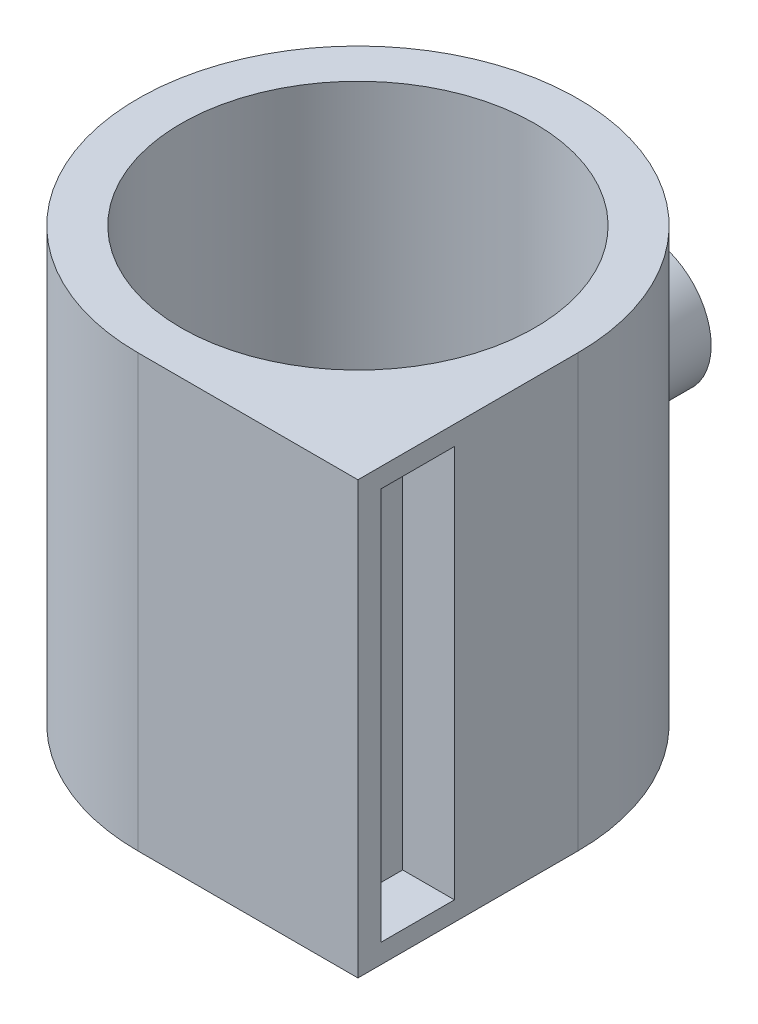
ISO-10303-21;
HEADER;
FILE_DESCRIPTION(('STEP AP214'),'2;1');
FILE_NAME('part.step','',(''),(''),'','','');
FILE_SCHEMA(('AUTOMOTIVE_DESIGN { 1 0 10303 214 1 1 1 1 }'));
ENDSEC;
DATA;
#1=APPLICATION_CONTEXT('core data for automotive mechanical design processes');
#2=APPLICATION_PROTOCOL_DEFINITION('international standard','automotive_design',2000,#1);
#3=PRODUCT_CONTEXT('',#1,'mechanical');
#4=PRODUCT('Part','Part','',(#3));
#5=PRODUCT_RELATED_PRODUCT_CATEGORY('part','',(#4));
#6=PRODUCT_DEFINITION_FORMATION('','',#4);
#7=PRODUCT_DEFINITION_CONTEXT('part definition',#1,'design');
#8=PRODUCT_DEFINITION('design','',#6,#7);
#9=PRODUCT_DEFINITION_SHAPE('','',#8);
#10=(LENGTH_UNIT() NAMED_UNIT(*) SI_UNIT(.MILLI.,.METRE.));
#11=(NAMED_UNIT(*) PLANE_ANGLE_UNIT() SI_UNIT($,.RADIAN.));
#12=(NAMED_UNIT(*) SI_UNIT($,.STERADIAN.) SOLID_ANGLE_UNIT());
#13=UNCERTAINTY_MEASURE_WITH_UNIT(LENGTH_MEASURE(1.E-05),#10,'distance_accuracy_value','');
#14=(GEOMETRIC_REPRESENTATION_CONTEXT(3) GLOBAL_UNCERTAINTY_ASSIGNED_CONTEXT((#13)) GLOBAL_UNIT_ASSIGNED_CONTEXT((#10,
#11,#12)) REPRESENTATION_CONTEXT('',''));
#15=CARTESIAN_POINT('',(0.,0.,0.));
#16=DIRECTION('',(0.,0.,1.));
#17=DIRECTION('',(1.,0.,0.));
#18=AXIS2_PLACEMENT_3D('',#15,#16,#17);
#19=CARTESIAN_POINT('',(-77.5,0.,0.));
#20=DIRECTION('',(1.,0.,0.));
#21=DIRECTION('',(0.,0.,-1.));
#22=AXIS2_PLACEMENT_3D('',#19,#20,#21);
#23=PLANE('',#22);
#24=DIRECTION('',(0.,1.,0.));
#25=VECTOR('',#24,1.);
#26=CARTESIAN_POINT('',(-77.5,47.75,-4.25248903601283));
#27=LINE('',#26,#25);
#28=CARTESIAN_POINT('',(-77.5,2.24999999999999,-4.25248903601283));
#29=VERTEX_POINT('',#28);
#30=CARTESIAN_POINT('',(-77.5,47.75,-4.25248903601283));
#31=VERTEX_POINT('',#30);
#32=EDGE_CURVE('E60',#29,#31,#27,.T.);
#33=ORIENTED_EDGE('',*,*,#32,.F.);
#34=DIRECTION('',(0.,0.,-1.));
#35=VECTOR('',#34,1.);
#36=CARTESIAN_POINT('',(-77.5,2.24999999999999,4.24751096398717));
#37=LINE('',#36,#35);
#38=CARTESIAN_POINT('',(-77.5,2.24999999999999,4.24751096398717));
#39=VERTEX_POINT('',#38);
#40=EDGE_CURVE('E213',#39,#29,#37,.T.);
#41=ORIENTED_EDGE('',*,*,#40,.F.);
#42=DIRECTION('',(0.,-1.,0.));
#43=VECTOR('',#42,1.);
#44=CARTESIAN_POINT('',(-77.5,47.75,4.24751096398718));
#45=LINE('',#44,#43);
#46=CARTESIAN_POINT('',(-77.5,47.75,4.24751096398718));
#47=VERTEX_POINT('',#46);
#48=EDGE_CURVE('E243',#47,#39,#45,.T.);
#49=ORIENTED_EDGE('',*,*,#48,.F.);
#50=DIRECTION('',(0.,0.,1.));
#51=VECTOR('',#50,1.);
#52=CARTESIAN_POINT('',(-77.5,47.75,4.24751096398718));
#53=LINE('',#52,#51);
#54=EDGE_CURVE('E241',#31,#47,#53,.T.);
#55=ORIENTED_EDGE('',*,*,#54,.F.);
#56=EDGE_LOOP('',(#33,#41,#49,#55));
#57=FACE_BOUND('',#56,.T.);
#58=DIRECTION('',(0.,-1.,0.));
#59=VECTOR('',#58,1.);
#60=CARTESIAN_POINT('',(-77.5,50.,6.93251096398718));
#61=LINE('',#60,#59);
#62=CARTESIAN_POINT('',(-77.5,50.,6.93251096398718));
#63=VERTEX_POINT('',#62);
#64=CARTESIAN_POINT('',(-77.5,0.,6.93251096398718));
#65=VERTEX_POINT('',#64);
#66=EDGE_CURVE('E46',#63,#65,#61,.T.);
#67=ORIENTED_EDGE('',*,*,#66,.T.);
#68=DIRECTION('',(0.,0.,1.));
#69=VECTOR('',#68,1.);
#70=CARTESIAN_POINT('',(-77.5,0.,0.));
#71=LINE('',#70,#69);
#72=CARTESIAN_POINT('',(-77.5,0.,-18.5674890360128));
#73=VERTEX_POINT('',#72);
#74=EDGE_CURVE('E87',#73,#65,#71,.T.);
#75=ORIENTED_EDGE('',*,*,#74,.F.);
#76=DIRECTION('',(0.,-1.,0.));
#77=VECTOR('',#76,1.);
#78=CARTESIAN_POINT('',(-77.5,50.,-18.5674890360128));
#79=LINE('',#78,#77);
#80=CARTESIAN_POINT('',(-77.5,50.,-18.5674890360128));
#81=VERTEX_POINT('',#80);
#82=EDGE_CURVE('E69',#81,#73,#79,.T.);
#83=ORIENTED_EDGE('',*,*,#82,.F.);
#84=DIRECTION('',(0.,0.,1.));
#85=VECTOR('',#84,1.);
#86=CARTESIAN_POINT('',(-77.5,50.,0.));
#87=LINE('',#86,#85);
#88=EDGE_CURVE('E84',#81,#63,#87,.T.);
#89=ORIENTED_EDGE('',*,*,#88,.T.);
#90=EDGE_LOOP('',(#67,#75,#83,#89));
#91=FACE_BOUND('',#90,.T.);
#92=ADVANCED_FACE('F42',(#57,#91),#23,.T.);
#93=CARTESIAN_POINT('',(-103.,25.,-48.));
#94=DIRECTION('',(0.,0.,-1.));
#95=DIRECTION('',(-1.,0.,0.));
#96=AXIS2_PLACEMENT_3D('',#93,#94,#95);
#97=CONICAL_SURFACE('',#96,2.,0.785398163397451);
#98=CARTESIAN_POINT('',(-103.,25.,-52.));
#99=DIRECTION('',(0.,0.,1.));
#100=DIRECTION('',(1.,0.,0.));
#101=AXIS2_PLACEMENT_3D('',#98,#99,#100);
#102=CIRCLE('',#101,6.00000000000006);
#103=CARTESIAN_POINT('',(-109.,25.,-52.));
#104=VERTEX_POINT('',#103);
#105=EDGE_CURVE('E197',#104,#104,#102,.T.);
#106=CARTESIAN_POINT('',(-103.,25.,-48.));
#107=DIRECTION('',(0.,0.,1.));
#108=DIRECTION('',(1.,0.,0.));
#109=AXIS2_PLACEMENT_3D('',#106,#107,#108);
#110=CIRCLE('',#109,2.);
#111=CARTESIAN_POINT('',(-105.,25.,-48.));
#112=VERTEX_POINT('',#111);
#113=EDGE_CURVE('E90',#112,#112,#110,.F.);
#114=CARTESIAN_POINT('',(-109.,25.,-52.));
#115=CARTESIAN_POINT('',(-108.958333333333,25.,-51.9583333333333));
#116=CARTESIAN_POINT('',(-108.916666666667,25.,-51.9166666666667));
#117=CARTESIAN_POINT('',(-108.833333333333,25.,-51.8333333333333));
#118=CARTESIAN_POINT('',(-108.791666666667,25.,-51.7916666666667));
#119=CARTESIAN_POINT('',(-108.708333333333,25.,-51.7083333333333));
#120=CARTESIAN_POINT('',(-108.666666666667,25.,-51.6666666666667));
#121=CARTESIAN_POINT('',(-108.583333333333,25.,-51.5833333333333));
#122=CARTESIAN_POINT('',(-108.541666666667,25.,-51.5416666666667));
#123=CARTESIAN_POINT('',(-108.458333333333,25.,-51.4583333333333));
#124=CARTESIAN_POINT('',(-108.416666666667,25.,-51.4166666666667));
#125=CARTESIAN_POINT('',(-108.333333333333,25.,-51.3333333333333));
#126=CARTESIAN_POINT('',(-108.291666666667,25.,-51.2916666666667));
#127=CARTESIAN_POINT('',(-108.208333333333,25.,-51.2083333333333));
#128=CARTESIAN_POINT('',(-108.166666666667,25.,-51.1666666666667));
#129=CARTESIAN_POINT('',(-108.083333333333,25.,-51.0833333333333));
#130=CARTESIAN_POINT('',(-108.041666666667,25.,-51.0416666666667));
#131=CARTESIAN_POINT('',(-107.958333333333,25.,-50.9583333333333));
#132=CARTESIAN_POINT('',(-107.916666666667,25.,-50.9166666666667));
#133=CARTESIAN_POINT('',(-107.833333333333,25.,-50.8333333333333));
#134=CARTESIAN_POINT('',(-107.791666666667,25.,-50.7916666666667));
#135=CARTESIAN_POINT('',(-107.708333333333,25.,-50.7083333333333));
#136=CARTESIAN_POINT('',(-107.666666666667,25.,-50.6666666666667));
#137=CARTESIAN_POINT('',(-107.583333333333,25.,-50.5833333333333));
#138=CARTESIAN_POINT('',(-107.541666666667,25.,-50.5416666666667));
#139=CARTESIAN_POINT('',(-107.458333333333,25.,-50.4583333333333));
#140=CARTESIAN_POINT('',(-107.416666666667,25.,-50.4166666666667));
#141=CARTESIAN_POINT('',(-107.333333333333,25.,-50.3333333333333));
#142=CARTESIAN_POINT('',(-107.291666666667,25.,-50.2916666666667));
#143=CARTESIAN_POINT('',(-107.208333333333,25.,-50.2083333333333));
#144=CARTESIAN_POINT('',(-107.166666666667,25.,-50.1666666666667));
#145=CARTESIAN_POINT('',(-107.083333333333,25.,-50.0833333333333));
#146=CARTESIAN_POINT('',(-107.041666666667,25.,-50.0416666666667));
#147=CARTESIAN_POINT('',(-106.958333333333,25.,-49.9583333333333));
#148=CARTESIAN_POINT('',(-106.916666666667,25.,-49.9166666666667));
#149=CARTESIAN_POINT('',(-106.833333333333,25.,-49.8333333333333));
#150=CARTESIAN_POINT('',(-106.791666666667,25.,-49.7916666666667));
#151=CARTESIAN_POINT('',(-106.708333333333,25.,-49.7083333333333));
#152=CARTESIAN_POINT('',(-106.666666666667,25.,-49.6666666666667));
#153=CARTESIAN_POINT('',(-106.583333333333,25.,-49.5833333333333));
#154=CARTESIAN_POINT('',(-106.541666666667,25.,-49.5416666666666));
#155=CARTESIAN_POINT('',(-106.458333333333,25.,-49.4583333333333));
#156=CARTESIAN_POINT('',(-106.416666666667,25.,-49.4166666666667));
#157=CARTESIAN_POINT('',(-106.333333333333,25.,-49.3333333333333));
#158=CARTESIAN_POINT('',(-106.291666666667,25.,-49.2916666666666));
#159=CARTESIAN_POINT('',(-106.208333333333,25.,-49.2083333333333));
#160=CARTESIAN_POINT('',(-106.166666666667,25.,-49.1666666666666));
#161=CARTESIAN_POINT('',(-106.083333333333,25.,-49.0833333333333));
#162=CARTESIAN_POINT('',(-106.041666666667,25.,-49.0416666666666));
#163=CARTESIAN_POINT('',(-105.958333333333,25.,-48.9583333333333));
#164=CARTESIAN_POINT('',(-105.916666666667,25.,-48.9166666666666));
#165=CARTESIAN_POINT('',(-105.833333333333,25.,-48.8333333333333));
#166=CARTESIAN_POINT('',(-105.791666666667,25.,-48.7916666666666));
#167=CARTESIAN_POINT('',(-105.708333333333,25.,-48.7083333333333));
#168=CARTESIAN_POINT('',(-105.666666666667,25.,-48.6666666666666));
#169=CARTESIAN_POINT('',(-105.583333333333,25.,-48.5833333333333));
#170=CARTESIAN_POINT('',(-105.541666666667,25.,-48.5416666666666));
#171=CARTESIAN_POINT('',(-105.458333333333,25.,-48.4583333333333));
#172=CARTESIAN_POINT('',(-105.416666666667,25.,-48.4166666666666));
#173=CARTESIAN_POINT('',(-105.333333333333,25.,-48.3333333333333));
#174=CARTESIAN_POINT('',(-105.291666666667,25.,-48.2916666666666));
#175=CARTESIAN_POINT('',(-105.208333333333,25.,-48.2083333333333));
#176=CARTESIAN_POINT('',(-105.166666666667,25.,-48.1666666666666));
#177=CARTESIAN_POINT('',(-105.083333333333,25.,-48.0833333333333));
#178=CARTESIAN_POINT('',(-105.041666666667,25.,-48.0416666666666));
#179=CARTESIAN_POINT('',(-105.,25.,-48.));
#180=B_SPLINE_CURVE_WITH_KNOTS('',3,(#114,#115,#116,#117,#118,#119,#120,#121,#122,#123,#124,
#125,#126,#127,#128,#129,#130,#131,#132,#133,#134,#135,#136,#137,#138,#139,#140,#141,#142,#143,
#144,#145,#146,#147,#148,#149,#150,#151,#152,#153,#154,#155,#156,#157,#158,#159,#160,#161,#162,
#163,#164,#165,#166,#167,#168,#169,#170,#171,#172,#173,#174,#175,#176,#177,#178,#179),
.UNSPECIFIED.,.F.,.F.,(4,2,2,2,2,2,2,2,2,2,2,2,2,2,2,2,2,2,2,2,2,2,2,2,2,2,2,2,2,2,2,2,4),(0.,
0.176776695296637,0.353553390593274,0.530330085889911,0.707106781186548,0.883883476483195,
1.06066017177984,1.23743686707647,1.41421356237311,1.59099025766975,1.76776695296639,
1.94454364826303,2.12132034355966,2.2980970388563,2.47487373415295,2.65165042944959,
2.82842712474622,3.00520382004286,3.1819805153395,3.35875721063614,3.53553390593278,
3.71231060122942,3.88908729652606,4.0658639918227,4.24264068711934,4.41941738241598,
4.59619407771261,4.77297077300926,4.9497474683059,5.12652416360254,5.30330085889918,
5.48007755419581,5.65685424949246),.UNSPECIFIED.);
#181=EDGE_CURVE('BSEAM127',#104,#112,#180,.T.);
#182=ORIENTED_EDGE('',*,*,#105,.F.);
#183=ORIENTED_EDGE('',*,*,#113,.F.);
#184=ORIENTED_EDGE('',*,*,#181,.T.);
#185=ORIENTED_EDGE('',*,*,#181,.F.);
#186=EDGE_LOOP('',(#182,#184,#183,#185));
#187=FACE_BOUND('',#186,.T.);
#188=ADVANCED_FACE('F127',(#187),#97,.F.);
#189=CARTESIAN_POINT('',(-103.,25.,-52.));
#190=DIRECTION('',(0.,0.,1.));
#191=DIRECTION('',(1.,0.,0.));
#192=AXIS2_PLACEMENT_3D('',#189,#190,#191);
#193=PLANE('',#192);
#194=ORIENTED_EDGE('',*,*,#105,.T.);
#195=EDGE_LOOP('',(#194));
#196=FACE_BOUND('',#195,.T.);
#197=CARTESIAN_POINT('',(-103.,25.,-52.));
#198=DIRECTION('',(0.,0.,1.));
#199=DIRECTION('',(1.,0.,0.));
#200=AXIS2_PLACEMENT_3D('',#197,#198,#199);
#201=CIRCLE('',#200,7.50000000000001);
#202=CARTESIAN_POINT('',(-95.5,25.,-52.));
#203=VERTEX_POINT('',#202);
#204=EDGE_CURVE('E52',#203,#203,#201,.T.);
#205=ORIENTED_EDGE('',*,*,#204,.F.);
#206=EDGE_LOOP('',(#205));
#207=FACE_BOUND('',#206,.T.);
#208=ADVANCED_FACE('F149',(#196,#207),#193,.F.);
#209=CARTESIAN_POINT('',(-103.,25.,6.93351096398718));
#210=DIRECTION('',(0.,0.,-1.));
#211=DIRECTION('',(-1.,0.,0.));
#212=AXIS2_PLACEMENT_3D('',#209,#210,#211);
#213=CYLINDRICAL_SURFACE('',#212,2.);
#214=ORIENTED_EDGE('',*,*,#113,.T.);
#215=EDGE_LOOP('',(#214));
#216=FACE_BOUND('',#215,.T.);
#217=CARTESIAN_POINT('',(-105.,25.,-38.969694799116));
#218=CARTESIAN_POINT('',(-104.99999513932,25.1120536873899,-38.9696960830209));
#219=CARTESIAN_POINT('',(-104.990551268163,25.2241818110143,-38.9706278838935));
#220=CARTESIAN_POINT('',(-104.95301990798,25.445330267315,-38.9742539673729));
#221=CARTESIAN_POINT('',(-104.924911781635,25.5543470203842,-38.9769502008886));
#222=CARTESIAN_POINT('',(-104.850877299024,25.7660380858509,-38.9837969003662));
#223=CARTESIAN_POINT('',(-104.80496163447,25.8687161612157,-38.9879464935808));
#224=CARTESIAN_POINT('',(-104.696635754659,26.064885587841,-38.9972312809159));
#225=CARTESIAN_POINT('',(-104.634228854769,26.1583787804375,-39.002366276876));
#226=CARTESIAN_POINT('',(-104.494459327629,26.3338712816188,-39.0130632385346));
#227=CARTESIAN_POINT('',(-104.417051192345,26.4158342719675,-39.0186264715752));
#228=CARTESIAN_POINT('',(-104.249573643612,26.5656271120379,-39.0295415517807));
#229=CARTESIAN_POINT('',(-104.159503655348,26.6334563197759,-39.0348933893348));
#230=CARTESIAN_POINT('',(-103.969037491867,26.7531810437944,-39.0447951171912));
#231=CARTESIAN_POINT('',(-103.868621084027,26.8050445180697,-39.0493433871046));
#232=CARTESIAN_POINT('',(-103.660453106719,26.8911605789493,-39.0571117405789));
#233=CARTESIAN_POINT('',(-103.55270170815,26.9254135757037,-39.0603318550723));
#234=CARTESIAN_POINT('',(-103.333288618737,26.9752301238837,-39.0650721881992));
#235=CARTESIAN_POINT('',(-103.221640561517,26.990853200295,-39.0665978198452));
#236=CARTESIAN_POINT('',(-102.997297329256,27.0031505803758,-39.0677956894787));
#237=CARTESIAN_POINT('',(-102.884602180225,26.9998253534804,-39.067467973382));
#238=CARTESIAN_POINT('',(-102.661767776896,26.9743688951965,-39.0650005083904));
#239=CARTESIAN_POINT('',(-102.55162113255,26.9523016717314,-39.0628669269964));
#240=CARTESIAN_POINT('',(-102.336602413527,26.8900873138496,-39.0570346306012));
#241=CARTESIAN_POINT('',(-102.231730404546,26.8499399543115,-39.053335896112));
#242=CARTESIAN_POINT('',(-102.030035824905,26.7526345966138,-39.0447785722716));
#243=CARTESIAN_POINT('',(-101.933227030357,26.6954482201379,-39.0399180506676));
#244=CARTESIAN_POINT('',(-101.750557253561,26.5657087458206,-39.0295826735495));
#245=CARTESIAN_POINT('',(-101.66469657692,26.4931552191692,-39.0241078008943));
#246=CARTESIAN_POINT('',(-101.505985506016,26.3343808704792,-39.0131313376707));
#247=CARTESIAN_POINT('',(-101.433190794661,26.2481043773937,-39.0076297308037));
#248=CARTESIAN_POINT('',(-101.303108981677,26.0645263432513,-38.9972426506239));
#249=CARTESIAN_POINT('',(-101.245821900805,25.9672247874378,-38.9923571781357));
#250=CARTESIAN_POINT('',(-101.148382079069,25.7643164513261,-38.9837549999125));
#251=CARTESIAN_POINT('',(-101.108232691427,25.6587080504639,-38.9800385229447));
#252=CARTESIAN_POINT('',(-101.046251567772,25.4422046106037,-38.9741998156193));
#253=CARTESIAN_POINT('',(-101.024419301132,25.3313097248476,-38.9720775390797));
#254=CARTESIAN_POINT('',(-100.999763605829,25.1078698005322,-38.9696754412969));
#255=CARTESIAN_POINT('',(-100.996862316182,24.9953334314265,-38.9693880733851));
#256=CARTESIAN_POINT('',(-101.009946534658,24.7713760923895,-38.9706684138276));
#257=CARTESIAN_POINT('',(-101.025931800094,24.6599551081443,-38.9722360983447));
#258=CARTESIAN_POINT('',(-101.076270259815,24.4416177852012,-38.9770430365472));
#259=CARTESIAN_POINT('',(-101.110586713974,24.334692896038,-38.9802789462554));
#260=CARTESIAN_POINT('',(-101.19657594961,24.128117328168,-38.9880550057656));
#261=CARTESIAN_POINT('',(-101.248249110059,24.0284668083502,-38.9925951840453));
#262=CARTESIAN_POINT('',(-101.367680306505,23.8389135776227,-39.0024864883886));
#263=CARTESIAN_POINT('',(-101.435489983319,23.749043540757,-39.0078401976494));
#264=CARTESIAN_POINT('',(-101.585195238741,23.5819335192938,-39.0187468359001));
#265=CARTESIAN_POINT('',(-101.667091149256,23.5046938323837,-39.0242997695817));
#266=CARTESIAN_POINT('',(-101.842981719018,23.364768989681,-39.0350019116049));
#267=CARTESIAN_POINT('',(-101.937016860016,23.3021345947533,-39.040149671886));
#268=CARTESIAN_POINT('',(-102.134316348903,23.1935474389377,-39.0494404043272));
#269=CARTESIAN_POINT('',(-102.237580575624,23.1475944590796,-39.0535833896762));
#270=CARTESIAN_POINT('',(-102.450229011896,23.0737607627662,-39.0603912096784));
#271=CARTESIAN_POINT('',(-102.559602452582,23.0458492723016,-39.0630585602478));
#272=CARTESIAN_POINT('',(-102.781510683826,23.0087904018186,-39.0666248784702));
#273=CARTESIAN_POINT('',(-102.894045390036,22.9996425216417,-39.0675238932595));
#274=CARTESIAN_POINT('',(-103.118582837839,23.0003773856469,-39.0674522365196));
#275=CARTESIAN_POINT('',(-103.230585848325,23.0101812805719,-39.0664893116247));
#276=CARTESIAN_POINT('',(-103.451345870677,23.0483762004233,-39.0628172599771));
#277=CARTESIAN_POINT('',(-103.560102879666,23.0767672418261,-39.0601081316764));
#278=CARTESIAN_POINT('',(-103.771283958187,23.1513089667847,-39.0532472762779));
#279=CARTESIAN_POINT('',(-103.873708800231,23.1974574789841,-39.0490957255633));
#280=CARTESIAN_POINT('',(-104.069370905807,23.3061956766683,-39.0398130645471));
#281=CARTESIAN_POINT('',(-104.162608237387,23.3687852403666,-39.0346819615016));
#282=CARTESIAN_POINT('',(-104.337652707514,23.50892466903,-39.0239896808848));
#283=CARTESIAN_POINT('',(-104.419412772049,23.5865332092017,-39.0184268695411));
#284=CARTESIAN_POINT('',(-104.568785127777,23.7543930213524,-39.0075119801462));
#285=CARTESIAN_POINT('',(-104.636394014464,23.8446473269647,-39.0021599530565));
#286=CARTESIAN_POINT('',(-104.755673387433,24.0354755918607,-38.9922586293314));
#287=CARTESIAN_POINT('',(-104.807304654175,24.136074149627,-38.9877113195195));
#288=CARTESIAN_POINT('',(-104.892874015791,24.3444924502705,-38.9799580411686));
#289=CARTESIAN_POINT('',(-104.926832128283,24.4523038665,-38.9767505558848));
#290=CARTESIAN_POINT('',(-104.967594562554,24.6339415387898,-38.972851505412));
#291=CARTESIAN_POINT('',(-104.979730065878,24.7066054056036,-38.9716733138807));
#292=CARTESIAN_POINT('',(-104.995934364968,24.8528354799734,-38.9700945406238));
#293=CARTESIAN_POINT('',(-105.000003192558,24.9264016839686,-38.9696939558306));
#294=CARTESIAN_POINT('',(-105.,25.,-38.969694799116));
#295=B_SPLINE_CURVE_WITH_KNOTS('',3,(#217,#218,#219,#220,#221,#222,#223,#224,#225,#226,#227,
#228,#229,#230,#231,#232,#233,#234,#235,#236,#237,#238,#239,#240,#241,#242,#243,#244,#245,#246,
#247,#248,#249,#250,#251,#252,#253,#254,#255,#256,#257,#258,#259,#260,#261,#262,#263,#264,#265,
#266,#267,#268,#269,#270,#271,#272,#273,#274,#275,#276,#277,#278,#279,#280,#281,#282,#283,#284,
#285,#286,#287,#288,#289,#290,#291,#292,#293,#294),.UNSPECIFIED.,.T.,.F.,(4,2,2,2,2,2,2,2,2,2,2,
2,2,2,2,2,2,2,2,2,2,2,2,2,2,2,2,2,2,2,2,2,2,2,2,2,2,2,4),(0.,0.335892301542,0.672156623548029,
1.00821936296058,1.3442145922482,1.68124552639673,2.01829176580891,2.35601008651016,
2.69372054135775,3.03034905179673,3.36696922246428,3.7024443648623,4.03792368448423,
4.37396489489532,4.71001548354643,5.04746586089092,5.38491668990609,5.72243351552498,
6.05994056333077,6.39605860283304,6.73217232334475,7.06761490457077,7.40306481044742,
7.73960302799373,8.07614917633362,8.41384811852923,8.75154262772707,9.08865958864431,
9.42576756333367,9.76147601144196,10.0971847571353,10.4328524659161,10.7685176883216,
11.1055217515753,11.4426067986747,11.7805128274546,12.1180352871242,12.3386545801012,
12.5592730027274),.UNSPECIFIED.);
#296=CARTESIAN_POINT('',(-105.,25.,-38.969694799116));
#297=VERTEX_POINT('',#296);
#298=EDGE_CURVE('E11',#297,#297,#295,.T.);
#299=ORIENTED_EDGE('',*,*,#298,.F.);
#300=EDGE_LOOP('',(#299));
#301=FACE_BOUND('',#300,.T.);
#302=ADVANCED_FACE('F120',(#216,#301),#213,.F.);
#303=CARTESIAN_POINT('',(-103.,25.,-52.));
#304=DIRECTION('',(0.,0.,1.));
#305=DIRECTION('',(1.,0.,0.));
#306=AXIS2_PLACEMENT_3D('',#303,#304,#305);
#307=CYLINDRICAL_SURFACE('',#306,7.50000000000001);
#308=ORIENTED_EDGE('',*,*,#204,.T.);
#309=EDGE_LOOP('',(#308));
#310=FACE_BOUND('',#309,.T.);
#311=CARTESIAN_POINT('',(-103.,32.5,-44.0674890360128));
#312=CARTESIAN_POINT('',(-103.205915668017,32.4999995296236,-44.0674887380694));
#313=CARTESIAN_POINT('',(-103.411839753064,32.4915127366717,-44.0649888700372));
#314=CARTESIAN_POINT('',(-103.822178844363,32.4576410220455,-44.0550575858018));
#315=CARTESIAN_POINT('',(-104.02659376787,32.432255180664,-44.0476259011914));
#316=CARTESIAN_POINT('',(-104.432443147541,32.3648099827454,-44.0280347092028));
#317=CARTESIAN_POINT('',(-104.633877308638,32.3227489868238,-44.0158747369746));
#318=CARTESIAN_POINT('',(-105.032387871591,32.2223017052596,-43.9871532253036));
#319=CARTESIAN_POINT('',(-105.229462632893,32.163909382826,-43.9705900583546));
#320=CARTESIAN_POINT('',(-105.617465027791,32.031417044921,-43.9335449139472));
#321=CARTESIAN_POINT('',(-105.80840334399,31.9573462441693,-43.9130702318881));
#322=CARTESIAN_POINT('',(-106.183326453736,31.7939872925513,-43.8687159729348));
#323=CARTESIAN_POINT('',(-106.367308602527,31.7046934235138,-43.8448351171478));
#324=CARTESIAN_POINT('',(-106.727017906385,31.5116045221839,-43.7943064604351));
#325=CARTESIAN_POINT('',(-106.902747752721,31.4078142620073,-43.7676595708076));
#326=CARTESIAN_POINT('',(-107.245017959279,31.186387336861,-43.712267740582));
#327=CARTESIAN_POINT('',(-107.411554057356,31.0687443277454,-43.6835218410073));
#328=CARTESIAN_POINT('',(-107.738346725457,30.817354316015,-43.6239520056865));
#329=CARTESIAN_POINT('',(-107.898346230261,30.6832810631069,-43.5930942637775));
#330=CARTESIAN_POINT('',(-108.206559935755,30.4023344532312,-43.5307912916036));
#331=CARTESIAN_POINT('',(-108.354773939753,30.2554608827199,-43.4993460515446));
#332=CARTESIAN_POINT('',(-108.63852966267,29.9497963854527,-43.4367090763184));
#333=CARTESIAN_POINT('',(-108.774067026199,29.7910013963167,-43.4055174316167));
#334=CARTESIAN_POINT('',(-109.03148209145,29.4625930424128,-43.3442669993079));
#335=CARTESIAN_POINT('',(-109.153364859209,29.292983726797,-43.3142077943162));
#336=CARTESIAN_POINT('',(-109.385215684508,28.9401213240984,-43.2554140504515));
#337=CARTESIAN_POINT('',(-109.494863957097,28.7566506419938,-43.2267229991831));
#338=CARTESIAN_POINT('',(-109.69822233168,28.3807490374233,-43.1722629708791));
#339=CARTESIAN_POINT('',(-109.791938259896,28.1883214233068,-43.1464929268282));
#340=CARTESIAN_POINT('',(-109.962724192924,27.7957625340694,-43.0986598629597));
#341=CARTESIAN_POINT('',(-110.039793978981,27.5956311577505,-43.0765968918593));
#342=CARTESIAN_POINT('',(-110.176614682252,27.189107578808,-43.0368838602041));
#343=CARTESIAN_POINT('',(-110.236366190089,26.9827155899614,-43.0192336491595));
#344=CARTESIAN_POINT('',(-110.336627738696,26.570857477845,-42.9893349386893));
#345=CARTESIAN_POINT('',(-110.3776138143,26.3655168632353,-42.9769534394786));
#346=CARTESIAN_POINT('',(-110.442292580671,25.9518899729857,-42.9573112509211));
#347=CARTESIAN_POINT('',(-110.465985858512,25.7436037975895,-42.950050387734));
#348=CARTESIAN_POINT('',(-110.495851802121,25.3257014994561,-42.9408854106707));
#349=CARTESIAN_POINT('',(-110.502027840913,25.1160856405473,-42.9389802655275));
#350=CARTESIAN_POINT('',(-110.496808743468,24.6970959579262,-42.9405862355656));
#351=CARTESIAN_POINT('',(-110.485413968034,24.4877221293323,-42.9440972395305));
#352=CARTESIAN_POINT('',(-110.445865913317,24.0780764073173,-42.9562054199177));
#353=CARTESIAN_POINT('',(-110.418309239498,23.8777412051803,-42.9646214640173));
#354=CARTESIAN_POINT('',(-110.34716184161,23.4801263686961,-42.9861415935933));
#355=CARTESIAN_POINT('',(-110.303565761193,23.2828477780638,-42.9992472451207));
#356=CARTESIAN_POINT('',(-110.200725916095,22.8928192157111,-43.0297542136444));
#357=CARTESIAN_POINT('',(-110.141486744799,22.7000679326701,-43.0471542695484));
#358=CARTESIAN_POINT('',(-110.007807488675,22.3202259814546,-43.0857571537641));
#359=CARTESIAN_POINT('',(-109.9333616678,22.1331374799846,-43.1069614166793));
#360=CARTESIAN_POINT('',(-109.768792551071,21.7635047153662,-43.1528675034471));
#361=CARTESIAN_POINT('',(-109.678479530366,21.5810501204456,-43.1776108901996));
#362=CARTESIAN_POINT('',(-109.483476450874,21.224305013117,-43.229701353751));
#363=CARTESIAN_POINT('',(-109.378781459854,21.0500173291345,-43.2570493227889));
#364=CARTESIAN_POINT('',(-109.155749765203,20.7107152903064,-43.3135993424565));
#365=CARTESIAN_POINT('',(-109.0374127273,20.5457011628404,-43.3428014385104));
#366=CARTESIAN_POINT('',(-108.787859851109,20.2259225744319,-43.4022857691537));
#367=CARTESIAN_POINT('',(-108.656643662547,20.0711583924506,-43.4325680331062));
#368=CARTESIAN_POINT('',(-108.376607280376,19.766782757273,-43.4946524585605));
#369=CARTESIAN_POINT('',(-108.227290939091,19.6176298417742,-43.5264667152571));
#370=CARTESIAN_POINT('',(-107.916610409116,19.3324260207335,-43.5895204046619));
#371=CARTESIAN_POINT('',(-107.755250139454,19.1963708859586,-43.6207600202664));
#372=CARTESIAN_POINT('',(-107.4213934988,18.9381661418748,-43.6818292321948));
#373=CARTESIAN_POINT('',(-107.248892296858,18.8160226292562,-43.71165820699));
#374=CARTESIAN_POINT('',(-106.893997941783,18.5866229433666,-43.7690579028449));
#375=CARTESIAN_POINT('',(-106.711608700967,18.4793609409843,-43.7966295063759));
#376=CARTESIAN_POINT('',(-106.336831857498,18.2798125119395,-43.8489364377003));
#377=CARTESIAN_POINT('',(-106.144385746765,18.1876305997302,-43.8736516491442));
#378=CARTESIAN_POINT('',(-105.752029296844,18.0198971910743,-43.9193197669178));
#379=CARTESIAN_POINT('',(-105.552121822374,17.9443393872419,-43.9402740996119));
#380=CARTESIAN_POINT('',(-105.146217406043,17.8104646331538,-43.977827237366));
#381=CARTESIAN_POINT('',(-104.940220605217,17.7521472839355,-43.9944261432143));
#382=CARTESIAN_POINT('',(-104.52367977828,17.6532854345892,-44.0227825612621));
#383=CARTESIAN_POINT('',(-104.31313591149,17.612740312816,-44.0345402427995));
#384=CARTESIAN_POINT('',(-103.896473294796,17.5508961838528,-44.0525494710011));
#385=CARTESIAN_POINT('',(-103.690453670192,17.5289795090739,-44.0589775371711));
#386=CARTESIAN_POINT('',(-103.277213907848,17.5022657177814,-44.066819507084));
#387=CARTESIAN_POINT('',(-103.069993797976,17.4974682054664,-44.0682335267536));
#388=CARTESIAN_POINT('',(-102.655919679773,17.5050361176334,-44.0660080358234));
#389=CARTESIAN_POINT('',(-102.449065631819,17.517399554331,-44.0623691105155));
#390=CARTESIAN_POINT('',(-102.037235511325,17.5591720268785,-44.0501404412785));
#391=CARTESIAN_POINT('',(-101.832259426356,17.5885809498444,-44.041550730136));
#392=CARTESIAN_POINT('',(-101.430116914293,17.6633535212265,-44.0198982194108));
#393=CARTESIAN_POINT('',(-101.232877629604,17.7083556854088,-44.0069369295326));
#394=CARTESIAN_POINT('',(-100.842907862811,17.8140567909992,-43.97684191994));
#395=CARTESIAN_POINT('',(-100.650178918099,17.8747610020074,-43.9597067996026));
#396=CARTESIAN_POINT('',(-100.270621628881,18.0113545957515,-43.921716792661));
#397=CARTESIAN_POINT('',(-100.08379170201,18.0872398655264,-43.9008629137353));
#398=CARTESIAN_POINT('',(-99.7170940821139,18.2536612276713,-43.8559581013117));
#399=CARTESIAN_POINT('',(-99.5372290426115,18.3442028371471,-43.8319059645004));
#400=CARTESIAN_POINT('',(-99.1817341080606,18.5414339588736,-43.7806564197348));
#401=CARTESIAN_POINT('',(-99.00628646784,18.6484369248016,-43.7534011103808));
#402=CARTESIAN_POINT('',(-98.6649187307005,18.876340545651,-43.6968944819025));
#403=CARTESIAN_POINT('',(-98.4990019579364,18.9972460058486,-43.6676424740652));
#404=CARTESIAN_POINT('',(-98.1777585701772,19.2521282342012,-43.607910043836));
#405=CARTESIAN_POINT('',(-98.0224324068177,19.3861055592132,-43.5774295691444));
#406=CARTESIAN_POINT('',(-97.7233133996678,19.6662795893743,-43.5160339777017));
#407=CARTESIAN_POINT('',(-97.579520765753,19.8124765167845,-43.4851188530534));
#408=CARTESIAN_POINT('',(-97.2995238552007,20.1215211569224,-43.422586451124));
#409=CARTESIAN_POINT('',(-97.1637620329754,20.2847728158077,-43.3909825288457));
#410=CARTESIAN_POINT('',(-96.9065013746015,20.622296697261,-43.329087908088));
#411=CARTESIAN_POINT('',(-96.7849977177873,20.7965651642207,-43.2987967679561));
#412=CARTESIAN_POINT('',(-96.5570193404107,21.1551140264299,-43.2403862657869));
#413=CARTESIAN_POINT('',(-96.450550273753,21.3393981522781,-43.2122677225665));
#414=CARTESIAN_POINT('',(-96.2535431498467,21.7166211218886,-43.1590675290183));
#415=CARTESIAN_POINT('',(-96.1629985656659,21.9095563789485,-43.1339846357963));
#416=CARTESIAN_POINT('',(-95.998900042944,22.3019247383659,-43.0877222942502));
#417=CARTESIAN_POINT('',(-95.9252699476037,22.5013239112538,-43.0665254399833));
#418=CARTESIAN_POINT('',(-95.7951296494944,22.9059631277247,-43.0285691794658));
#419=CARTESIAN_POINT('',(-95.7386127395468,23.1112008484115,-43.0118080350508));
#420=CARTESIAN_POINT('',(-95.643181021036,23.526055280542,-42.9832564710079));
#421=CARTESIAN_POINT('',(-95.6042648583236,23.7356716538066,-42.9714656689814));
#422=CARTESIAN_POINT('',(-95.5444036305868,24.1576835379658,-42.953244441164));
#423=CARTESIAN_POINT('',(-95.5234579150934,24.3700789479863,-42.9468138213531));
#424=CARTESIAN_POINT('',(-95.5002177799405,24.7874348259803,-42.9396740830179));
#425=CARTESIAN_POINT('',(-95.4972095227697,24.9923521264756,-42.9387459950373));
#426=CARTESIAN_POINT('',(-95.5079673544192,25.4017030925894,-42.9420552778804));
#427=CARTESIAN_POINT('',(-95.5217332106253,25.6061367648752,-42.9462925770734));
#428=CARTESIAN_POINT('',(-95.5659113651201,26.0130160076066,-42.959800467864));
#429=CARTESIAN_POINT('',(-95.596322831949,26.2154616768402,-42.9690708080574));
#430=CARTESIAN_POINT('',(-95.673518527321,26.6169271416201,-42.9923593818648));
#431=CARTESIAN_POINT('',(-95.7203028341644,26.815946920778,-43.0063776381849));
#432=CARTESIAN_POINT('',(-95.8291992159839,27.2068772898818,-43.0385494174267));
#433=CARTESIAN_POINT('',(-95.8911257750884,27.398843780141,-43.0566526994632));
#434=CARTESIAN_POINT('',(-96.03010460634,27.7768924991283,-43.0965693846593));
#435=CARTESIAN_POINT('',(-96.1071619531362,27.9629727293112,-43.1183840322288));
#436=CARTESIAN_POINT('',(-96.2757937578397,28.3279814775326,-43.165104749293));
#437=CARTESIAN_POINT('',(-96.3673653665054,28.5069113906096,-43.1900102118333));
#438=CARTESIAN_POINT('',(-96.5644266205696,28.8566434124557,-43.2422491171976));
#439=CARTESIAN_POINT('',(-96.6699212369907,29.0274425884779,-43.2695834260642));
#440=CARTESIAN_POINT('',(-96.898035860212,29.3656711610408,-43.3269385493401));
#441=CARTESIAN_POINT('',(-97.0211260756995,29.5327733061701,-43.3570199109565));
#442=CARTESIAN_POINT('',(-97.2806254637082,29.8561021831727,-43.4181735409251));
#443=CARTESIAN_POINT('',(-97.417034972152,30.0123286405829,-43.449245834256));
#444=CARTESIAN_POINT('',(-97.7023598683196,30.3130009603973,-43.5115531679054));
#445=CARTESIAN_POINT('',(-97.8512803574085,30.4574419694892,-43.5427882696923));
#446=CARTESIAN_POINT('',(-98.1605992701152,30.7335120304703,-43.604562785744));
#447=CARTESIAN_POINT('',(-98.3209938264179,30.8651453641897,-43.6351024298789));
#448=CARTESIAN_POINT('',(-98.6569862581723,31.1183095040436,-43.6955246434295));
#449=CARTESIAN_POINT('',(-98.8328850098057,31.2394516062914,-43.7253645147346));
#450=CARTESIAN_POINT('',(-99.194594561361,31.4664099551577,-43.7826114631335));
#451=CARTESIAN_POINT('',(-99.3804017253542,31.5722317713746,-43.8100194229243));
#452=CARTESIAN_POINT('',(-99.7606859823474,31.7677578153092,-43.8616316925016));
#453=CARTESIAN_POINT('',(-99.9551610621463,31.8574657615206,-43.8858367410629));
#454=CARTESIAN_POINT('',(-100.351446534795,32.020044207738,-43.9303536581019));
#455=CARTESIAN_POINT('',(-100.553256164931,32.0929164527079,-43.9506659300156));
#456=CARTESIAN_POINT('',(-100.938654794054,32.2136473204241,-43.9846833299054));
#457=CARTESIAN_POINT('',(-101.121597054764,32.2634393368332,-43.9988844505899));
#458=CARTESIAN_POINT('',(-101.490967716856,32.3490649856391,-44.0234720425632));
#459=CARTESIAN_POINT('',(-101.677395902449,32.3848994790658,-44.0338587491584));
#460=CARTESIAN_POINT('',(-102.052624178142,32.4423454155783,-44.0505765443744));
#461=CARTESIAN_POINT('',(-102.241424416658,32.4639559641278,-44.0569073779228));
#462=CARTESIAN_POINT('',(-102.620147650583,32.4927810411338,-44.0653630505681));
#463=CARTESIAN_POINT('',(-102.810070244855,32.5000004338596,-44.0674893108259));
#464=CARTESIAN_POINT('',(-103.,32.5,-44.0674890360128));
#465=B_SPLINE_CURVE_WITH_KNOTS('',3,(#311,#312,#313,#314,#315,#316,#317,#318,#319,#320,#321,
#322,#323,#324,#325,#326,#327,#328,#329,#330,#331,#332,#333,#334,#335,#336,#337,#338,#339,#340,
#341,#342,#343,#344,#345,#346,#347,#348,#349,#350,#351,#352,#353,#354,#355,#356,#357,#358,#359,
#360,#361,#362,#363,#364,#365,#366,#367,#368,#369,#370,#371,#372,#373,#374,#375,#376,#377,#378,
#379,#380,#381,#382,#383,#384,#385,#386,#387,#388,#389,#390,#391,#392,#393,#394,#395,#396,#397,
#398,#399,#400,#401,#402,#403,#404,#405,#406,#407,#408,#409,#410,#411,#412,#413,#414,#415,#416,
#417,#418,#419,#420,#421,#422,#423,#424,#425,#426,#427,#428,#429,#430,#431,#432,#433,#434,#435,
#436,#437,#438,#439,#440,#441,#442,#443,#444,#445,#446,#447,#448,#449,#450,#451,#452,#453,#454,
#455,#456,#457,#458,#459,#460,#461,#462,#463,#464),.UNSPECIFIED.,.T.,.F.,(4,2,2,2,2,2,2,2,2,2,2,
2,2,2,2,2,2,2,2,2,2,2,2,2,2,2,2,2,2,2,2,2,2,2,2,2,2,2,2,2,2,2,2,2,2,2,2,2,2,2,2,2,2,2,2,2,2,2,2,
2,2,2,2,2,2,2,2,2,2,2,2,2,2,2,2,2,4),(0.,0.61757237040623,1.23517835407715,1.85284507150706,
2.47074040871656,3.08749436088958,3.70448049401372,4.32126399601831,4.93833107318431,
5.57065496826598,6.20298941423114,6.8355403231617,7.46785576458129,8.11403344701502,
8.75997432116778,9.40592368341785,10.0518510136266,10.6803353183719,11.3087982857028,
11.937140231438,12.5654692748372,13.171946429269,13.7786263004416,14.385128225885,
14.9918593517194,15.606411750101,16.2211754351543,16.8359541871149,17.4507496639471,
18.0903050633753,18.7296532547569,19.3692805674666,20.008656625476,20.6522916860424,
21.2956821210191,21.9390576660882,22.5824107050707,23.2034923399808,23.8245596151577,
24.445554956971,25.0665461862817,25.674010798069,26.2816795398143,26.8891838700146,
27.4969174179678,28.1181222488949,28.7395424429575,29.3609891208755,29.9824471046899,
30.6256813121225,31.2686974125343,31.911954685118,32.5549476897113,33.1949862790024,
33.8347736920111,34.4745118733052,35.1142268972857,35.7283043704725,36.3423733280706,
36.9564116152954,37.5704528390939,38.1773181308538,38.7843873052441,39.3913374553669,
39.998504898098,40.6269263760446,41.2553637073415,41.8840585399934,42.5125424615158,
43.158718511171,43.8046590542923,44.4504503458546,45.0961746732586,45.6659948242067,
46.2357798177755,46.8056006413941,47.3752288305705),.UNSPECIFIED.);
#466=CARTESIAN_POINT('',(-103.,32.5,-44.0674890360128));
#467=VERTEX_POINT('',#466);
#468=EDGE_CURVE('E113',#467,#467,#465,.T.);
#469=ORIENTED_EDGE('',*,*,#468,.F.);
#470=EDGE_LOOP('',(#469));
#471=FACE_BOUND('',#470,.T.);
#472=ADVANCED_FACE('F169',(#310,#471),#307,.T.);
#473=CARTESIAN_POINT('',(-103.,50.,-18.5674890360128));
#474=DIRECTION('',(0.,-1.,0.));
#475=DIRECTION('',(0.,0.,-1.));
#476=AXIS2_PLACEMENT_3D('',#473,#474,#475);
#477=CYLINDRICAL_SURFACE('',#476,25.5);
#478=ORIENTED_EDGE('',*,*,#468,.T.);
#479=EDGE_LOOP('',(#478));
#480=FACE_BOUND('',#479,.T.);
#481=CARTESIAN_POINT('',(-103.,0.,-18.5674890360128));
#482=DIRECTION('',(0.,1.,0.));
#483=DIRECTION('',(0.,0.,1.));
#484=AXIS2_PLACEMENT_3D('',#481,#482,#483);
#485=CIRCLE('',#484,25.5);
#486=CARTESIAN_POINT('',(-103.,0.,6.93251096398718));
#487=VERTEX_POINT('',#486);
#488=EDGE_CURVE('E184',#73,#487,#485,.T.);
#489=ORIENTED_EDGE('',*,*,#488,.T.);
#490=DIRECTION('',(0.,-1.,0.));
#491=VECTOR('',#490,1.);
#492=CARTESIAN_POINT('',(-103.,50.,6.93251096398718));
#493=LINE('',#492,#491);
#494=CARTESIAN_POINT('',(-103.,50.,6.93251096398718));
#495=VERTEX_POINT('',#494);
#496=EDGE_CURVE('E89',#495,#487,#493,.T.);
#497=ORIENTED_EDGE('',*,*,#496,.F.);
#498=CARTESIAN_POINT('',(-103.,50.,-18.5674890360128));
#499=DIRECTION('',(0.,1.,0.));
#500=DIRECTION('',(0.,0.,1.));
#501=AXIS2_PLACEMENT_3D('',#498,#499,#500);
#502=CIRCLE('',#501,25.5);
#503=EDGE_CURVE('E94',#81,#495,#502,.T.);
#504=ORIENTED_EDGE('',*,*,#503,.F.);
#505=ORIENTED_EDGE('',*,*,#82,.T.);
#506=EDGE_LOOP('',(#489,#497,#504,#505));
#507=FACE_BOUND('',#506,.T.);
#508=ADVANCED_FACE('F95',(#480,#507),#477,.T.);
#509=CARTESIAN_POINT('',(0.,50.,6.93251096398718));
#510=DIRECTION('',(0.,0.,-1.));
#511=DIRECTION('',(-1.,0.,0.));
#512=AXIS2_PLACEMENT_3D('',#509,#510,#511);
#513=PLANE('',#512);
#514=ORIENTED_EDGE('',*,*,#66,.F.);
#515=DIRECTION('',(1.,0.,0.));
#516=VECTOR('',#515,1.);
#517=CARTESIAN_POINT('',(0.,50.,6.93251096398718));
#518=LINE('',#517,#516);
#519=EDGE_CURVE('E100',#495,#63,#518,.T.);
#520=ORIENTED_EDGE('',*,*,#519,.F.);
#521=ORIENTED_EDGE('',*,*,#496,.T.);
#522=DIRECTION('',(1.,0.,0.));
#523=VECTOR('',#522,1.);
#524=CARTESIAN_POINT('',(0.,0.,6.93251096398718));
#525=LINE('',#524,#523);
#526=EDGE_CURVE('E107',#487,#65,#525,.T.);
#527=ORIENTED_EDGE('',*,*,#526,.T.);
#528=EDGE_LOOP('',(#514,#520,#521,#527));
#529=FACE_BOUND('',#528,.T.);
#530=ADVANCED_FACE('F130',(#529),#513,.F.);
#531=CARTESIAN_POINT('',(-103.,50.,-18.5674890360128));
#532=DIRECTION('',(0.,-1.,0.));
#533=DIRECTION('',(0.,0.,-1.));
#534=AXIS2_PLACEMENT_3D('',#531,#532,#533);
#535=CYLINDRICAL_SURFACE('',#534,20.5);
#536=ORIENTED_EDGE('',*,*,#298,.T.);
#537=EDGE_LOOP('',(#536));
#538=FACE_BOUND('',#537,.T.);
#539=CARTESIAN_POINT('',(-103.,50.,-18.5674890360128));
#540=DIRECTION('',(0.,1.,0.));
#541=DIRECTION('',(0.,0.,1.));
#542=AXIS2_PLACEMENT_3D('',#539,#540,#541);
#543=CIRCLE('',#542,20.5);
#544=CARTESIAN_POINT('',(-103.,50.,1.93251096398716));
#545=VERTEX_POINT('',#544);
#546=EDGE_CURVE('E103',#545,#545,#543,.T.);
#547=ORIENTED_EDGE('',*,*,#546,.T.);
#548=EDGE_LOOP('',(#547));
#549=FACE_BOUND('',#548,.T.);
#550=CARTESIAN_POINT('',(-103.,0.,-18.5674890360128));
#551=DIRECTION('',(0.,1.,0.));
#552=DIRECTION('',(0.,0.,1.));
#553=AXIS2_PLACEMENT_3D('',#550,#551,#552);
#554=CIRCLE('',#553,20.5);
#555=CARTESIAN_POINT('',(-103.,0.,1.93251096398716));
#556=VERTEX_POINT('',#555);
#557=EDGE_CURVE('E179',#556,#556,#554,.T.);
#558=ORIENTED_EDGE('',*,*,#557,.F.);
#559=EDGE_LOOP('',(#558));
#560=FACE_BOUND('',#559,.T.);
#561=ADVANCED_FACE('F132',(#538,#549,#560),#535,.F.);
#562=CARTESIAN_POINT('',(0.,0.,0.));
#563=DIRECTION('',(0.,1.,0.));
#564=DIRECTION('',(0.,0.,1.));
#565=AXIS2_PLACEMENT_3D('',#562,#563,#564);
#566=PLANE('',#565);
#567=ORIENTED_EDGE('',*,*,#557,.T.);
#568=EDGE_LOOP('',(#567));
#569=FACE_BOUND('',#568,.T.);
#570=ORIENTED_EDGE('',*,*,#74,.T.);
#571=ORIENTED_EDGE('',*,*,#526,.F.);
#572=ORIENTED_EDGE('',*,*,#488,.F.);
#573=EDGE_LOOP('',(#570,#571,#572));
#574=FACE_BOUND('',#573,.T.);
#575=ADVANCED_FACE('F134',(#569,#574),#566,.F.);
#576=CARTESIAN_POINT('',(0.,50.,0.));
#577=DIRECTION('',(0.,1.,0.));
#578=DIRECTION('',(0.,0.,1.));
#579=AXIS2_PLACEMENT_3D('',#576,#577,#578);
#580=PLANE('',#579);
#581=ORIENTED_EDGE('',*,*,#546,.F.);
#582=EDGE_LOOP('',(#581));
#583=FACE_BOUND('',#582,.T.);
#584=ORIENTED_EDGE('',*,*,#519,.T.);
#585=ORIENTED_EDGE('',*,*,#88,.F.);
#586=ORIENTED_EDGE('',*,*,#503,.T.);
#587=EDGE_LOOP('',(#584,#585,#586));
#588=FACE_BOUND('',#587,.T.);
#589=ADVANCED_FACE('F44',(#583,#588),#580,.T.);
#590=CARTESIAN_POINT('',(-83.5,47.75,-4.25248903601283));
#591=DIRECTION('',(0.,0.,-1.));
#592=DIRECTION('',(0.,1.,0.));
#593=AXIS2_PLACEMENT_3D('',#590,#591,#592);
#594=PLANE('',#593);
#595=ORIENTED_EDGE('',*,*,#32,.T.);
#596=DIRECTION('',(1.,0.,0.));
#597=VECTOR('',#596,1.);
#598=CARTESIAN_POINT('',(-83.5,47.75,-4.25248903601283));
#599=LINE('',#598,#597);
#600=CARTESIAN_POINT('',(-83.5,47.75,-4.25248903601283));
#601=VERTEX_POINT('',#600);
#602=EDGE_CURVE('E219',#601,#31,#599,.T.);
#603=ORIENTED_EDGE('',*,*,#602,.F.);
#604=DIRECTION('',(0.,1.,0.));
#605=VECTOR('',#604,1.);
#606=CARTESIAN_POINT('',(-83.5,47.75,-4.25248903601283));
#607=LINE('',#606,#605);
#608=CARTESIAN_POINT('',(-83.5,2.24999999999999,-4.25248903601283));
#609=VERTEX_POINT('',#608);
#610=EDGE_CURVE('E252',#609,#601,#607,.T.);
#611=ORIENTED_EDGE('',*,*,#610,.F.);
#612=DIRECTION('',(1.,0.,0.));
#613=VECTOR('',#612,1.);
#614=CARTESIAN_POINT('',(-83.5,2.24999999999999,-4.25248903601283));
#615=LINE('',#614,#613);
#616=EDGE_CURVE('E198',#609,#29,#615,.T.);
#617=ORIENTED_EDGE('',*,*,#616,.T.);
#618=EDGE_LOOP('',(#595,#603,#611,#617));
#619=FACE_BOUND('',#618,.T.);
#620=ADVANCED_FACE('F129',(#619),#594,.F.);
#621=CARTESIAN_POINT('',(-83.5,2.24999999999999,4.24751096398717));
#622=DIRECTION('',(0.,-1.,0.));
#623=DIRECTION('',(0.,0.,-1.));
#624=AXIS2_PLACEMENT_3D('',#621,#622,#623);
#625=PLANE('',#624);
#626=ORIENTED_EDGE('',*,*,#40,.T.);
#627=ORIENTED_EDGE('',*,*,#616,.F.);
#628=DIRECTION('',(0.,0.,-1.));
#629=VECTOR('',#628,1.);
#630=CARTESIAN_POINT('',(-83.5,2.24999999999999,4.24751096398717));
#631=LINE('',#630,#629);
#632=CARTESIAN_POINT('',(-83.5,2.24999999999999,4.24751096398717));
#633=VERTEX_POINT('',#632);
#634=EDGE_CURVE('E221',#633,#609,#631,.T.);
#635=ORIENTED_EDGE('',*,*,#634,.F.);
#636=DIRECTION('',(1.,0.,0.));
#637=VECTOR('',#636,1.);
#638=CARTESIAN_POINT('',(-83.5,2.24999999999999,4.24751096398717));
#639=LINE('',#638,#637);
#640=EDGE_CURVE('E202',#633,#39,#639,.T.);
#641=ORIENTED_EDGE('',*,*,#640,.T.);
#642=EDGE_LOOP('',(#626,#627,#635,#641));
#643=FACE_BOUND('',#642,.T.);
#644=ADVANCED_FACE('F273',(#643),#625,.F.);
#645=CARTESIAN_POINT('',(-83.5,47.75,4.24751096398718));
#646=DIRECTION('',(0.,0.,1.));
#647=DIRECTION('',(0.,-1.,0.));
#648=AXIS2_PLACEMENT_3D('',#645,#646,#647);
#649=PLANE('',#648);
#650=ORIENTED_EDGE('',*,*,#48,.T.);
#651=ORIENTED_EDGE('',*,*,#640,.F.);
#652=DIRECTION('',(0.,-1.,0.));
#653=VECTOR('',#652,1.);
#654=CARTESIAN_POINT('',(-83.5,47.75,4.24751096398718));
#655=LINE('',#654,#653);
#656=CARTESIAN_POINT('',(-83.5,47.75,4.24751096398718));
#657=VERTEX_POINT('',#656);
#658=EDGE_CURVE('E228',#657,#633,#655,.T.);
#659=ORIENTED_EDGE('',*,*,#658,.F.);
#660=DIRECTION('',(1.,0.,0.));
#661=VECTOR('',#660,1.);
#662=CARTESIAN_POINT('',(-83.5,47.75,4.24751096398718));
#663=LINE('',#662,#661);
#664=EDGE_CURVE('E210',#657,#47,#663,.T.);
#665=ORIENTED_EDGE('',*,*,#664,.T.);
#666=EDGE_LOOP('',(#650,#651,#659,#665));
#667=FACE_BOUND('',#666,.T.);
#668=ADVANCED_FACE('F274',(#667),#649,.F.);
#669=CARTESIAN_POINT('',(-83.5,47.75,4.24751096398718));
#670=DIRECTION('',(0.,1.,0.));
#671=DIRECTION('',(0.,0.,1.));
#672=AXIS2_PLACEMENT_3D('',#669,#670,#671);
#673=PLANE('',#672);
#674=ORIENTED_EDGE('',*,*,#54,.T.);
#675=ORIENTED_EDGE('',*,*,#664,.F.);
#676=DIRECTION('',(0.,0.,1.));
#677=VECTOR('',#676,1.);
#678=CARTESIAN_POINT('',(-83.5,47.75,4.24751096398718));
#679=LINE('',#678,#677);
#680=EDGE_CURVE('E235',#601,#657,#679,.T.);
#681=ORIENTED_EDGE('',*,*,#680,.F.);
#682=ORIENTED_EDGE('',*,*,#602,.T.);
#683=EDGE_LOOP('',(#674,#675,#681,#682));
#684=FACE_BOUND('',#683,.T.);
#685=ADVANCED_FACE('F265',(#684),#673,.F.);
#686=CARTESIAN_POINT('',(-83.5,0.,0.));
#687=DIRECTION('',(1.,0.,0.));
#688=DIRECTION('',(0.,0.,-1.));
#689=AXIS2_PLACEMENT_3D('',#686,#687,#688);
#690=PLANE('',#689);
#691=ORIENTED_EDGE('',*,*,#610,.T.);
#692=ORIENTED_EDGE('',*,*,#680,.T.);
#693=ORIENTED_EDGE('',*,*,#658,.T.);
#694=ORIENTED_EDGE('',*,*,#634,.T.);
#695=EDGE_LOOP('',(#691,#692,#693,#694));
#696=FACE_BOUND('',#695,.T.);
#697=ADVANCED_FACE('F260',(#696),#690,.T.);
#698=CLOSED_SHELL('',(#92,#188,#208,#302,#472,#508,#530,#561,#575,#589,#620,#644,#668,#685,#697));
#699=MANIFOLD_SOLID_BREP('B2',#698);
#700=ADVANCED_BREP_SHAPE_REPRESENTATION('',(#18,#699),#14);
#701=SHAPE_DEFINITION_REPRESENTATION(#9,#700);
ENDSEC;
END-ISO-10303-21;
